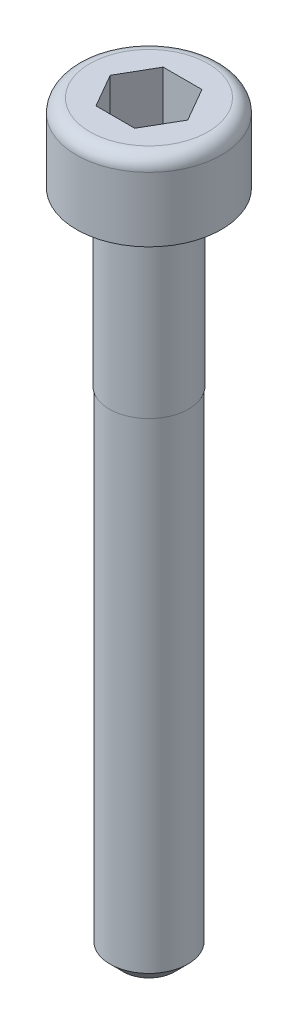
ISO-10303-21;
HEADER;
FILE_DESCRIPTION(('STEP AP214'),'2;1');
FILE_NAME('part.step','',(''),(''),'','','');
FILE_SCHEMA(('AUTOMOTIVE_DESIGN { 1 0 10303 214 1 1 1 1 }'));
ENDSEC;
DATA;
#1=APPLICATION_CONTEXT('core data for automotive mechanical design processes');
#2=APPLICATION_PROTOCOL_DEFINITION('international standard','automotive_design',2000,#1);
#3=PRODUCT_CONTEXT('',#1,'mechanical');
#4=PRODUCT('Part','Part','',(#3));
#5=PRODUCT_RELATED_PRODUCT_CATEGORY('part','',(#4));
#6=PRODUCT_DEFINITION_FORMATION('','',#4);
#7=PRODUCT_DEFINITION_CONTEXT('part definition',#1,'design');
#8=PRODUCT_DEFINITION('design','',#6,#7);
#9=PRODUCT_DEFINITION_SHAPE('','',#8);
#10=(LENGTH_UNIT() NAMED_UNIT(*) SI_UNIT(.MILLI.,.METRE.));
#11=(NAMED_UNIT(*) PLANE_ANGLE_UNIT() SI_UNIT($,.RADIAN.));
#12=(NAMED_UNIT(*) SI_UNIT($,.STERADIAN.) SOLID_ANGLE_UNIT());
#13=UNCERTAINTY_MEASURE_WITH_UNIT(LENGTH_MEASURE(1.E-05),#10,'distance_accuracy_value','');
#14=(GEOMETRIC_REPRESENTATION_CONTEXT(3) GLOBAL_UNCERTAINTY_ASSIGNED_CONTEXT((#13)) GLOBAL_UNIT_ASSIGNED_CONTEXT((#10,
#11,#12)) REPRESENTATION_CONTEXT('',''));
#15=CARTESIAN_POINT('',(0.,0.,0.));
#16=DIRECTION('',(0.,0.,1.));
#17=DIRECTION('',(1.,0.,0.));
#18=AXIS2_PLACEMENT_3D('',#15,#16,#17);
#19=CARTESIAN_POINT('',(0.,2.9,0.));
#20=DIRECTION('',(0.,1.,0.));
#21=DIRECTION('',(-1.,0.,0.));
#22=AXIS2_PLACEMENT_3D('',#19,#20,#21);
#23=PLANE('',#22);
#24=DIRECTION('',(0.5,0.,-0.866025403784439));
#25=VECTOR('',#24,1.);
#26=CARTESIAN_POINT('',(0.721687836487032,2.9,1.25));
#27=LINE('',#26,#25);
#28=CARTESIAN_POINT('',(0.721687836487032,2.9,1.25));
#29=VERTEX_POINT('',#28);
#30=CARTESIAN_POINT('',(1.44337567297406,2.9,0.));
#31=VERTEX_POINT('',#30);
#32=EDGE_CURVE('E44',#29,#31,#27,.T.);
#33=ORIENTED_EDGE('',*,*,#32,.F.);
#34=DIRECTION('',(1.,0.,0.));
#35=VECTOR('',#34,1.);
#36=CARTESIAN_POINT('',(-0.721687836487033,2.9,1.25));
#37=LINE('',#36,#35);
#38=CARTESIAN_POINT('',(-0.721687836487033,2.9,1.25));
#39=VERTEX_POINT('',#38);
#40=EDGE_CURVE('E127',#39,#29,#37,.T.);
#41=ORIENTED_EDGE('',*,*,#40,.F.);
#42=DIRECTION('',(0.5,0.,0.866025403784439));
#43=VECTOR('',#42,1.);
#44=CARTESIAN_POINT('',(-1.44337567297406,2.9,0.));
#45=LINE('',#44,#43);
#46=CARTESIAN_POINT('',(-1.44337567297406,2.9,0.));
#47=VERTEX_POINT('',#46);
#48=EDGE_CURVE('E125',#47,#39,#45,.T.);
#49=ORIENTED_EDGE('',*,*,#48,.F.);
#50=DIRECTION('',(-0.5,0.,0.866025403784439));
#51=VECTOR('',#50,1.);
#52=CARTESIAN_POINT('',(-0.721687836487032,2.9,-1.25));
#53=LINE('',#52,#51);
#54=CARTESIAN_POINT('',(-0.721687836487032,2.9,-1.25));
#55=VERTEX_POINT('',#54);
#56=EDGE_CURVE('E92',#55,#47,#53,.T.);
#57=ORIENTED_EDGE('',*,*,#56,.F.);
#58=DIRECTION('',(-1.,0.,0.));
#59=VECTOR('',#58,1.);
#60=CARTESIAN_POINT('',(0.721687836487033,2.9,-1.25));
#61=LINE('',#60,#59);
#62=CARTESIAN_POINT('',(0.721687836487033,2.9,-1.25));
#63=VERTEX_POINT('',#62);
#64=EDGE_CURVE('E121',#63,#55,#61,.T.);
#65=ORIENTED_EDGE('',*,*,#64,.F.);
#66=DIRECTION('',(-0.5,0.,-0.866025403784439));
#67=VECTOR('',#66,1.);
#68=CARTESIAN_POINT('',(1.44337567297406,2.9,0.));
#69=LINE('',#68,#67);
#70=EDGE_CURVE('E118',#31,#63,#69,.T.);
#71=ORIENTED_EDGE('',*,*,#70,.F.);
#72=EDGE_LOOP('',(#33,#41,#49,#57,#65,#71));
#73=FACE_BOUND('',#72,.T.);
#74=CARTESIAN_POINT('',(0.,2.9,0.));
#75=DIRECTION('',(0.,1.,0.));
#76=DIRECTION('',(-1.,0.,0.));
#77=AXIS2_PLACEMENT_3D('',#74,#75,#76);
#78=CIRCLE('',#77,2.2);
#79=CARTESIAN_POINT('',(-2.2,2.9,0.));
#80=VERTEX_POINT('',#79);
#81=EDGE_CURVE('E11',#80,#80,#78,.T.);
#82=ORIENTED_EDGE('',*,*,#81,.T.);
#83=EDGE_LOOP('',(#82));
#84=FACE_BOUND('',#83,.T.);
#85=ADVANCED_FACE('F30',(#73,#84),#23,.T.);
#86=CARTESIAN_POINT('',(0.,2.4,0.));
#87=DIRECTION('',(0.,1.,0.));
#88=DIRECTION('',(-1.,0.,0.));
#89=AXIS2_PLACEMENT_3D('',#86,#87,#88);
#90=TOROIDAL_SURFACE('',#89,2.2,0.5);
#91=CARTESIAN_POINT('',(0.,2.4,0.));
#92=DIRECTION('',(0.,1.,0.));
#93=DIRECTION('',(-1.,0.,0.));
#94=AXIS2_PLACEMENT_3D('',#91,#92,#93);
#95=CIRCLE('',#94,2.7);
#96=CARTESIAN_POINT('',(-2.7,2.4,0.));
#97=VERTEX_POINT('',#96);
#98=EDGE_CURVE('E37',#97,#97,#95,.T.);
#99=ORIENTED_EDGE('',*,*,#98,.T.);
#100=EDGE_LOOP('',(#99));
#101=FACE_BOUND('',#100,.T.);
#102=ORIENTED_EDGE('',*,*,#81,.F.);
#103=EDGE_LOOP('',(#102));
#104=FACE_BOUND('',#103,.T.);
#105=ADVANCED_FACE('F156',(#101,#104),#90,.T.);
#106=CARTESIAN_POINT('',(0.,15.8257226222034,0.));
#107=DIRECTION('',(0.,1.,0.));
#108=DIRECTION('',(-1.,0.,0.));
#109=AXIS2_PLACEMENT_3D('',#106,#107,#108);
#110=CYLINDRICAL_SURFACE('',#109,2.7);
#111=CARTESIAN_POINT('',(0.,0.,0.));
#112=DIRECTION('',(0.,1.,0.));
#113=DIRECTION('',(-1.,0.,0.));
#114=AXIS2_PLACEMENT_3D('',#111,#112,#113);
#115=CIRCLE('',#114,2.7);
#116=CARTESIAN_POINT('',(-2.7,0.,0.));
#117=VERTEX_POINT('',#116);
#118=EDGE_CURVE('E151',#117,#117,#115,.T.);
#119=ORIENTED_EDGE('',*,*,#118,.T.);
#120=EDGE_LOOP('',(#119));
#121=FACE_BOUND('',#120,.T.);
#122=ORIENTED_EDGE('',*,*,#98,.F.);
#123=EDGE_LOOP('',(#122));
#124=FACE_BOUND('',#123,.T.);
#125=ADVANCED_FACE('F159',(#121,#124),#110,.T.);
#126=CARTESIAN_POINT('',(-2.7,0.,0.));
#127=DIRECTION('',(0.,-1.,0.));
#128=DIRECTION('',(1.,0.,0.));
#129=AXIS2_PLACEMENT_3D('',#126,#127,#128);
#130=PLANE('',#129);
#131=CARTESIAN_POINT('',(0.,0.,0.));
#132=DIRECTION('',(0.,1.,0.));
#133=DIRECTION('',(-1.,0.,0.));
#134=AXIS2_PLACEMENT_3D('',#131,#132,#133);
#135=CIRCLE('',#134,1.475);
#136=CARTESIAN_POINT('',(-1.475,0.,0.));
#137=VERTEX_POINT('',#136);
#138=EDGE_CURVE('E148',#137,#137,#135,.T.);
#139=ORIENTED_EDGE('',*,*,#138,.T.);
#140=EDGE_LOOP('',(#139));
#141=FACE_BOUND('',#140,.T.);
#142=ORIENTED_EDGE('',*,*,#118,.F.);
#143=EDGE_LOOP('',(#142));
#144=FACE_BOUND('',#143,.T.);
#145=ADVANCED_FACE('F161',(#141,#144),#130,.T.);
#146=CARTESIAN_POINT('',(0.,15.8257226222034,0.));
#147=DIRECTION('',(0.,1.,0.));
#148=DIRECTION('',(-1.,0.,0.));
#149=AXIS2_PLACEMENT_3D('',#146,#147,#148);
#150=CYLINDRICAL_SURFACE('',#149,1.475);
#151=CARTESIAN_POINT('',(0.,-6.4,0.));
#152=DIRECTION('',(0.,1.,0.));
#153=DIRECTION('',(-1.,0.,0.));
#154=AXIS2_PLACEMENT_3D('',#151,#152,#153);
#155=CIRCLE('',#154,1.475);
#156=CARTESIAN_POINT('',(-1.475,-6.4,0.));
#157=VERTEX_POINT('',#156);
#158=EDGE_CURVE('E145',#157,#157,#155,.T.);
#159=ORIENTED_EDGE('',*,*,#158,.T.);
#160=EDGE_LOOP('',(#159));
#161=FACE_BOUND('',#160,.T.);
#162=ORIENTED_EDGE('',*,*,#138,.F.);
#163=EDGE_LOOP('',(#162));
#164=FACE_BOUND('',#163,.T.);
#165=ADVANCED_FACE('F168',(#161,#164),#150,.T.);
#166=CARTESIAN_POINT('',(-1.475,-6.4,0.));
#167=DIRECTION('',(0.,-1.,0.));
#168=DIRECTION('',(1.,0.,0.));
#169=AXIS2_PLACEMENT_3D('',#166,#167,#168);
#170=PLANE('',#169);
#171=CARTESIAN_POINT('',(0.,-6.4,0.));
#172=DIRECTION('',(0.,1.,0.));
#173=DIRECTION('',(-1.,0.,0.));
#174=AXIS2_PLACEMENT_3D('',#171,#172,#173);
#175=CIRCLE('',#174,1.45);
#176=CARTESIAN_POINT('',(-1.45,-6.4,0.));
#177=VERTEX_POINT('',#176);
#178=EDGE_CURVE('E142',#177,#177,#175,.T.);
#179=ORIENTED_EDGE('',*,*,#178,.T.);
#180=EDGE_LOOP('',(#179));
#181=FACE_BOUND('',#180,.T.);
#182=ORIENTED_EDGE('',*,*,#158,.F.);
#183=EDGE_LOOP('',(#182));
#184=FACE_BOUND('',#183,.T.);
#185=ADVANCED_FACE('F205',(#181,#184),#170,.T.);
#186=CARTESIAN_POINT('',(0.,15.8257226222034,0.));
#187=DIRECTION('',(0.,1.,0.));
#188=DIRECTION('',(-1.,0.,0.));
#189=AXIS2_PLACEMENT_3D('',#186,#187,#188);
#190=CYLINDRICAL_SURFACE('',#189,1.45);
#191=CARTESIAN_POINT('',(0.,-24.3,0.));
#192=DIRECTION('',(0.,1.,0.));
#193=DIRECTION('',(-1.,0.,0.));
#194=AXIS2_PLACEMENT_3D('',#191,#192,#193);
#195=CIRCLE('',#194,1.44999999999999);
#196=CARTESIAN_POINT('',(-1.44999999999999,-24.3,0.));
#197=VERTEX_POINT('',#196);
#198=EDGE_CURVE('E139',#197,#197,#195,.T.);
#199=ORIENTED_EDGE('',*,*,#198,.T.);
#200=EDGE_LOOP('',(#199));
#201=FACE_BOUND('',#200,.T.);
#202=ORIENTED_EDGE('',*,*,#178,.F.);
#203=EDGE_LOOP('',(#202));
#204=FACE_BOUND('',#203,.T.);
#205=ADVANCED_FACE('F201',(#201,#204),#190,.T.);
#206=CARTESIAN_POINT('',(0.,-24.3,0.));
#207=DIRECTION('',(0.,1.,0.));
#208=DIRECTION('',(-1.,0.,0.));
#209=AXIS2_PLACEMENT_3D('',#206,#207,#208);
#210=CONICAL_SURFACE('',#209,1.44999999999999,0.785398163397448);
#211=CARTESIAN_POINT('',(0.,-24.8,0.));
#212=DIRECTION('',(0.,1.,0.));
#213=DIRECTION('',(-1.,0.,0.));
#214=AXIS2_PLACEMENT_3D('',#211,#212,#213);
#215=CIRCLE('',#214,0.949999999999994);
#216=CARTESIAN_POINT('',(-0.949999999999995,-24.8,0.));
#217=VERTEX_POINT('',#216);
#218=EDGE_CURVE('E131',#217,#217,#215,.T.);
#219=ORIENTED_EDGE('',*,*,#218,.T.);
#220=EDGE_LOOP('',(#219));
#221=FACE_BOUND('',#220,.T.);
#222=ORIENTED_EDGE('',*,*,#198,.F.);
#223=EDGE_LOOP('',(#222));
#224=FACE_BOUND('',#223,.T.);
#225=ADVANCED_FACE('F193',(#221,#224),#210,.T.);
#226=CARTESIAN_POINT('',(-0.949999999999995,-24.8,0.));
#227=DIRECTION('',(0.,-1.,0.));
#228=DIRECTION('',(1.,0.,0.));
#229=AXIS2_PLACEMENT_3D('',#226,#227,#228);
#230=PLANE('',#229);
#231=ORIENTED_EDGE('',*,*,#218,.F.);
#232=EDGE_LOOP('',(#231));
#233=FACE_BOUND('',#232,.T.);
#234=ADVANCED_FACE('F186',(#233),#230,.T.);
#235=CARTESIAN_POINT('',(0.721687836487032,0.9,1.25));
#236=DIRECTION('',(0.866025403784439,0.,0.5));
#237=DIRECTION('',(0.5,0.,-0.866025403784439));
#238=AXIS2_PLACEMENT_3D('',#235,#236,#237);
#239=PLANE('',#238);
#240=ORIENTED_EDGE('',*,*,#32,.T.);
#241=DIRECTION('',(0.,1.,0.));
#242=VECTOR('',#241,1.);
#243=CARTESIAN_POINT('',(1.44337567297406,0.9,0.));
#244=LINE('',#243,#242);
#245=CARTESIAN_POINT('',(1.44337567297406,0.9,0.));
#246=VERTEX_POINT('',#245);
#247=EDGE_CURVE('E74',#246,#31,#244,.T.);
#248=ORIENTED_EDGE('',*,*,#247,.F.);
#249=DIRECTION('',(0.5,0.,-0.866025403784439));
#250=VECTOR('',#249,1.);
#251=CARTESIAN_POINT('',(0.721687836487032,0.9,1.25));
#252=LINE('',#251,#250);
#253=CARTESIAN_POINT('',(0.721687836487032,0.9,1.25));
#254=VERTEX_POINT('',#253);
#255=EDGE_CURVE('E129',#254,#246,#252,.T.);
#256=ORIENTED_EDGE('',*,*,#255,.F.);
#257=DIRECTION('',(0.,1.,0.));
#258=VECTOR('',#257,1.);
#259=CARTESIAN_POINT('',(0.721687836487032,0.9,1.25));
#260=LINE('',#259,#258);
#261=EDGE_CURVE('E52',#254,#29,#260,.T.);
#262=ORIENTED_EDGE('',*,*,#261,.T.);
#263=EDGE_LOOP('',(#240,#248,#256,#262));
#264=FACE_BOUND('',#263,.T.);
#265=ADVANCED_FACE('F183',(#264),#239,.F.);
#266=CARTESIAN_POINT('',(-0.721687836487033,0.9,1.25));
#267=DIRECTION('',(0.,0.,1.));
#268=DIRECTION('',(1.,0.,0.));
#269=AXIS2_PLACEMENT_3D('',#266,#267,#268);
#270=PLANE('',#269);
#271=ORIENTED_EDGE('',*,*,#40,.T.);
#272=ORIENTED_EDGE('',*,*,#261,.F.);
#273=DIRECTION('',(1.,0.,0.));
#274=VECTOR('',#273,1.);
#275=CARTESIAN_POINT('',(-0.721687836487033,0.9,1.25));
#276=LINE('',#275,#274);
#277=CARTESIAN_POINT('',(-0.721687836487033,0.9,1.25));
#278=VERTEX_POINT('',#277);
#279=EDGE_CURVE('E104',#278,#254,#276,.T.);
#280=ORIENTED_EDGE('',*,*,#279,.F.);
#281=DIRECTION('',(0.,1.,0.));
#282=VECTOR('',#281,1.);
#283=CARTESIAN_POINT('',(-0.721687836487033,0.9,1.25));
#284=LINE('',#283,#282);
#285=EDGE_CURVE('E96',#278,#39,#284,.T.);
#286=ORIENTED_EDGE('',*,*,#285,.T.);
#287=EDGE_LOOP('',(#271,#272,#280,#286));
#288=FACE_BOUND('',#287,.T.);
#289=ADVANCED_FACE('F185',(#288),#270,.F.);
#290=CARTESIAN_POINT('',(-1.44337567297406,0.9,0.));
#291=DIRECTION('',(-0.866025403784439,0.,0.5));
#292=DIRECTION('',(0.5,0.,0.866025403784439));
#293=AXIS2_PLACEMENT_3D('',#290,#291,#292);
#294=PLANE('',#293);
#295=ORIENTED_EDGE('',*,*,#48,.T.);
#296=ORIENTED_EDGE('',*,*,#285,.F.);
#297=DIRECTION('',(0.5,0.,0.866025403784439));
#298=VECTOR('',#297,1.);
#299=CARTESIAN_POINT('',(-1.44337567297406,0.9,0.));
#300=LINE('',#299,#298);
#301=CARTESIAN_POINT('',(-1.44337567297406,0.9,0.));
#302=VERTEX_POINT('',#301);
#303=EDGE_CURVE('E100',#302,#278,#300,.T.);
#304=ORIENTED_EDGE('',*,*,#303,.F.);
#305=DIRECTION('',(0.,1.,0.));
#306=VECTOR('',#305,1.);
#307=CARTESIAN_POINT('',(-1.44337567297406,0.9,0.));
#308=LINE('',#307,#306);
#309=EDGE_CURVE('E85',#302,#47,#308,.T.);
#310=ORIENTED_EDGE('',*,*,#309,.T.);
#311=EDGE_LOOP('',(#295,#296,#304,#310));
#312=FACE_BOUND('',#311,.T.);
#313=ADVANCED_FACE('F101',(#312),#294,.F.);
#314=CARTESIAN_POINT('',(-0.721687836487031,0.9,-1.25));
#315=DIRECTION('',(-0.866025403784439,0.,-0.5));
#316=DIRECTION('',(-0.5,0.,0.866025403784439));
#317=AXIS2_PLACEMENT_3D('',#314,#315,#316);
#318=PLANE('',#317);
#319=ORIENTED_EDGE('',*,*,#56,.T.);
#320=ORIENTED_EDGE('',*,*,#309,.F.);
#321=DIRECTION('',(-0.5,0.,0.866025403784439));
#322=VECTOR('',#321,1.);
#323=CARTESIAN_POINT('',(-0.721687836487031,0.9,-1.25));
#324=LINE('',#323,#322);
#325=CARTESIAN_POINT('',(-0.721687836487031,0.9,-1.25));
#326=VERTEX_POINT('',#325);
#327=EDGE_CURVE('E89',#326,#302,#324,.T.);
#328=ORIENTED_EDGE('',*,*,#327,.F.);
#329=DIRECTION('',(0.,1.,0.));
#330=VECTOR('',#329,1.);
#331=CARTESIAN_POINT('',(-0.721687836487031,0.9,-1.25));
#332=LINE('',#331,#330);
#333=EDGE_CURVE('E97',#326,#55,#332,.T.);
#334=ORIENTED_EDGE('',*,*,#333,.T.);
#335=EDGE_LOOP('',(#319,#320,#328,#334));
#336=FACE_BOUND('',#335,.T.);
#337=ADVANCED_FACE('F87',(#336),#318,.F.);
#338=CARTESIAN_POINT('',(0.721687836487033,0.9,-1.25));
#339=DIRECTION('',(0.,0.,-1.));
#340=DIRECTION('',(-1.,0.,0.));
#341=AXIS2_PLACEMENT_3D('',#338,#339,#340);
#342=PLANE('',#341);
#343=ORIENTED_EDGE('',*,*,#64,.T.);
#344=ORIENTED_EDGE('',*,*,#333,.F.);
#345=DIRECTION('',(-1.,0.,0.));
#346=VECTOR('',#345,1.);
#347=CARTESIAN_POINT('',(0.721687836487033,0.9,-1.25));
#348=LINE('',#347,#346);
#349=CARTESIAN_POINT('',(0.721687836487033,0.9,-1.25));
#350=VERTEX_POINT('',#349);
#351=EDGE_CURVE('E110',#350,#326,#348,.T.);
#352=ORIENTED_EDGE('',*,*,#351,.F.);
#353=DIRECTION('',(0.,1.,0.));
#354=VECTOR('',#353,1.);
#355=CARTESIAN_POINT('',(0.721687836487033,0.9,-1.25));
#356=LINE('',#355,#354);
#357=EDGE_CURVE('E134',#350,#63,#356,.T.);
#358=ORIENTED_EDGE('',*,*,#357,.T.);
#359=EDGE_LOOP('',(#343,#344,#352,#358));
#360=FACE_BOUND('',#359,.T.);
#361=ADVANCED_FACE('F270',(#360),#342,.F.);
#362=CARTESIAN_POINT('',(1.44337567297406,0.9,0.));
#363=DIRECTION('',(0.866025403784439,0.,-0.5));
#364=DIRECTION('',(-0.5,0.,-0.866025403784439));
#365=AXIS2_PLACEMENT_3D('',#362,#363,#364);
#366=PLANE('',#365);
#367=ORIENTED_EDGE('',*,*,#70,.T.);
#368=ORIENTED_EDGE('',*,*,#357,.F.);
#369=DIRECTION('',(-0.5,0.,-0.866025403784439));
#370=VECTOR('',#369,1.);
#371=CARTESIAN_POINT('',(1.44337567297406,0.9,0.));
#372=LINE('',#371,#370);
#373=EDGE_CURVE('E112',#246,#350,#372,.T.);
#374=ORIENTED_EDGE('',*,*,#373,.F.);
#375=ORIENTED_EDGE('',*,*,#247,.T.);
#376=EDGE_LOOP('',(#367,#368,#374,#375));
#377=FACE_BOUND('',#376,.T.);
#378=ADVANCED_FACE('F181',(#377),#366,.F.);
#379=CARTESIAN_POINT('',(0.,0.9,2.5));
#380=DIRECTION('',(0.,-1.,0.));
#381=DIRECTION('',(0.,0.,-1.));
#382=AXIS2_PLACEMENT_3D('',#379,#380,#381);
#383=PLANE('',#382);
#384=ORIENTED_EDGE('',*,*,#255,.T.);
#385=ORIENTED_EDGE('',*,*,#373,.T.);
#386=ORIENTED_EDGE('',*,*,#351,.T.);
#387=ORIENTED_EDGE('',*,*,#327,.T.);
#388=ORIENTED_EDGE('',*,*,#303,.T.);
#389=ORIENTED_EDGE('',*,*,#279,.T.);
#390=EDGE_LOOP('',(#384,#385,#386,#387,#388,#389));
#391=FACE_BOUND('',#390,.T.);
#392=ADVANCED_FACE('F107',(#391),#383,.F.);
#393=CLOSED_SHELL('',(#85,#105,#125,#145,#165,#185,#205,#225,#234,#265,#289,#313,#337,#361,#378,#392));
#394=MANIFOLD_SOLID_BREP('B2',#393);
#395=ADVANCED_BREP_SHAPE_REPRESENTATION('',(#18,#394),#14);
#396=SHAPE_DEFINITION_REPRESENTATION(#9,#395);
ENDSEC;
END-ISO-10303-21;
